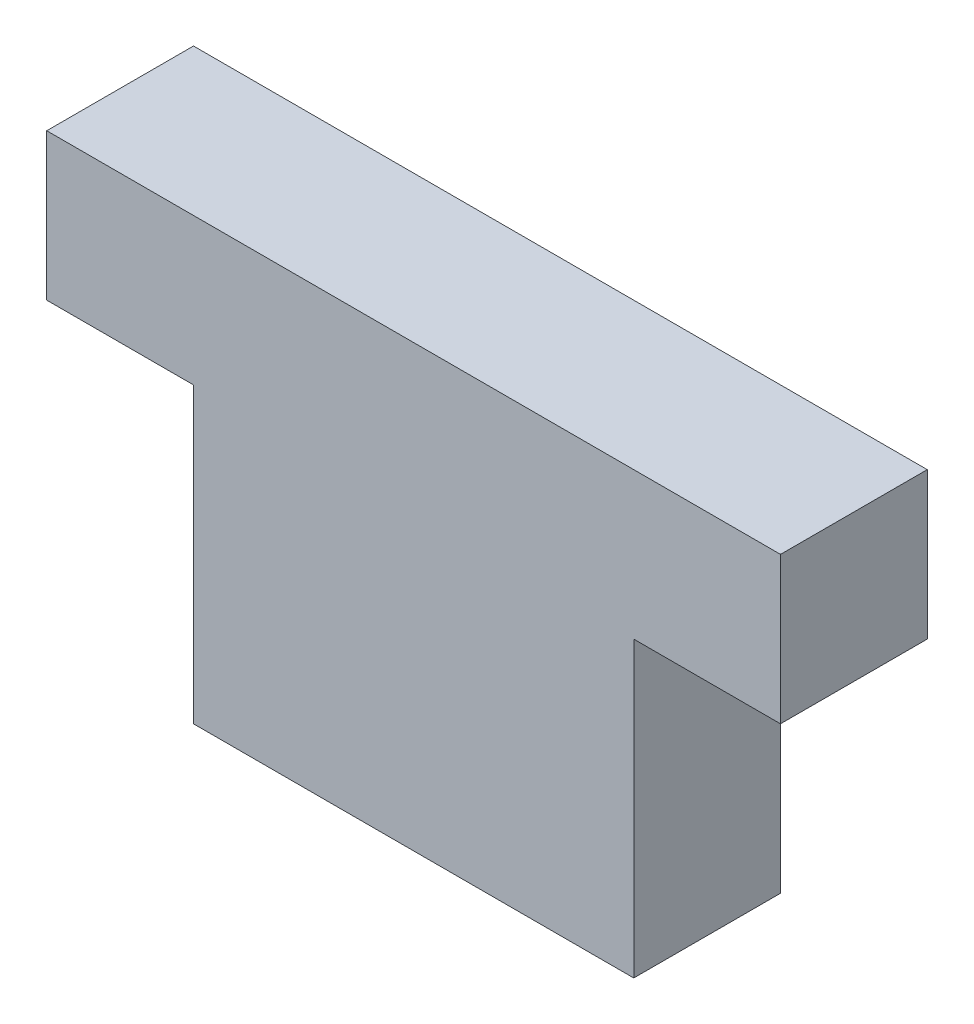
ISO-10303-21;
HEADER;
FILE_DESCRIPTION(('STEP AP214'),'2;1');
FILE_NAME('part.step','',(''),(''),'','','');
FILE_SCHEMA(('AUTOMOTIVE_DESIGN { 1 0 10303 214 1 1 1 1 }'));
ENDSEC;
DATA;
#1=APPLICATION_CONTEXT('core data for automotive mechanical design processes');
#2=APPLICATION_PROTOCOL_DEFINITION('international standard','automotive_design',2000,#1);
#3=PRODUCT_CONTEXT('',#1,'mechanical');
#4=PRODUCT('Part','Part','',(#3));
#5=PRODUCT_RELATED_PRODUCT_CATEGORY('part','',(#4));
#6=PRODUCT_DEFINITION_FORMATION('','',#4);
#7=PRODUCT_DEFINITION_CONTEXT('part definition',#1,'design');
#8=PRODUCT_DEFINITION('design','',#6,#7);
#9=PRODUCT_DEFINITION_SHAPE('','',#8);
#10=(LENGTH_UNIT() NAMED_UNIT(*) SI_UNIT(.MILLI.,.METRE.));
#11=(NAMED_UNIT(*) PLANE_ANGLE_UNIT() SI_UNIT($,.RADIAN.));
#12=(NAMED_UNIT(*) SI_UNIT($,.STERADIAN.) SOLID_ANGLE_UNIT());
#13=UNCERTAINTY_MEASURE_WITH_UNIT(LENGTH_MEASURE(1.E-05),#10,'distance_accuracy_value','');
#14=(GEOMETRIC_REPRESENTATION_CONTEXT(3) GLOBAL_UNCERTAINTY_ASSIGNED_CONTEXT((#13)) GLOBAL_UNIT_ASSIGNED_CONTEXT((#10,
#11,#12)) REPRESENTATION_CONTEXT('',''));
#15=CARTESIAN_POINT('',(0.,0.,0.));
#16=DIRECTION('',(0.,0.,1.));
#17=DIRECTION('',(1.,0.,0.));
#18=AXIS2_PLACEMENT_3D('',#15,#16,#17);
#19=CARTESIAN_POINT('',(-20.,10.,5.));
#20=DIRECTION('',(0.,1.,0.));
#21=DIRECTION('',(0.,0.,1.));
#22=AXIS2_PLACEMENT_3D('',#19,#20,#21);
#23=PLANE('',#22);
#24=DIRECTION('',(1.,0.,0.));
#25=VECTOR('',#24,1.);
#26=CARTESIAN_POINT('',(-20.,10.,0.));
#27=LINE('',#26,#25);
#28=CARTESIAN_POINT('',(-20.,10.,0.));
#29=VERTEX_POINT('',#28);
#30=CARTESIAN_POINT('',(-15.,10.,0.));
#31=VERTEX_POINT('',#30);
#32=EDGE_CURVE('E131',#29,#31,#27,.T.);
#33=ORIENTED_EDGE('',*,*,#32,.T.);
#34=DIRECTION('',(0.,0.,-1.));
#35=VECTOR('',#34,1.);
#36=CARTESIAN_POINT('',(-15.,10.,5.));
#37=LINE('',#36,#35);
#38=CARTESIAN_POINT('',(-15.,10.,5.));
#39=VERTEX_POINT('',#38);
#40=EDGE_CURVE('E11',#39,#31,#37,.T.);
#41=ORIENTED_EDGE('',*,*,#40,.F.);
#42=DIRECTION('',(1.,0.,0.));
#43=VECTOR('',#42,1.);
#44=CARTESIAN_POINT('',(-20.,10.,5.));
#45=LINE('',#44,#43);
#46=CARTESIAN_POINT('',(-20.,10.,5.));
#47=VERTEX_POINT('',#46);
#48=EDGE_CURVE('E145',#47,#39,#45,.T.);
#49=ORIENTED_EDGE('',*,*,#48,.F.);
#50=DIRECTION('',(0.,0.,-1.));
#51=VECTOR('',#50,1.);
#52=CARTESIAN_POINT('',(-20.,10.,5.));
#53=LINE('',#52,#51);
#54=EDGE_CURVE('E127',#47,#29,#53,.T.);
#55=ORIENTED_EDGE('',*,*,#54,.T.);
#56=EDGE_LOOP('',(#33,#41,#49,#55));
#57=FACE_BOUND('',#56,.T.);
#58=ADVANCED_FACE('F35',(#57),#23,.F.);
#59=CARTESIAN_POINT('',(-15.,10.,5.));
#60=DIRECTION('',(1.,0.,0.));
#61=DIRECTION('',(0.,1.,0.));
#62=AXIS2_PLACEMENT_3D('',#59,#60,#61);
#63=PLANE('',#62);
#64=DIRECTION('',(0.,-1.,0.));
#65=VECTOR('',#64,1.);
#66=CARTESIAN_POINT('',(-15.,10.,0.));
#67=LINE('',#66,#65);
#68=CARTESIAN_POINT('',(-15.,0.,0.));
#69=VERTEX_POINT('',#68);
#70=EDGE_CURVE('E134',#31,#69,#67,.T.);
#71=ORIENTED_EDGE('',*,*,#70,.T.);
#72=DIRECTION('',(0.,0.,-1.));
#73=VECTOR('',#72,1.);
#74=CARTESIAN_POINT('',(-15.,0.,5.));
#75=LINE('',#74,#73);
#76=CARTESIAN_POINT('',(-15.,0.,5.));
#77=VERTEX_POINT('',#76);
#78=EDGE_CURVE('E43',#77,#69,#75,.T.);
#79=ORIENTED_EDGE('',*,*,#78,.F.);
#80=DIRECTION('',(0.,-1.,0.));
#81=VECTOR('',#80,1.);
#82=CARTESIAN_POINT('',(-15.,10.,5.));
#83=LINE('',#82,#81);
#84=EDGE_CURVE('E94',#39,#77,#83,.T.);
#85=ORIENTED_EDGE('',*,*,#84,.F.);
#86=ORIENTED_EDGE('',*,*,#40,.T.);
#87=EDGE_LOOP('',(#71,#79,#85,#86));
#88=FACE_BOUND('',#87,.T.);
#89=ADVANCED_FACE('F180',(#88),#63,.F.);
#90=CARTESIAN_POINT('',(-15.,0.,5.));
#91=DIRECTION('',(0.,1.,0.));
#92=DIRECTION('',(0.,0.,1.));
#93=AXIS2_PLACEMENT_3D('',#90,#91,#92);
#94=PLANE('',#93);
#95=DIRECTION('',(1.,0.,0.));
#96=VECTOR('',#95,1.);
#97=CARTESIAN_POINT('',(-15.,0.,0.));
#98=LINE('',#97,#96);
#99=CARTESIAN_POINT('',(0.,0.,0.));
#100=VERTEX_POINT('',#99);
#101=EDGE_CURVE('E136',#69,#100,#98,.T.);
#102=ORIENTED_EDGE('',*,*,#101,.T.);
#103=DIRECTION('',(0.,0.,-1.));
#104=VECTOR('',#103,1.);
#105=CARTESIAN_POINT('',(0.,0.,5.));
#106=LINE('',#105,#104);
#107=CARTESIAN_POINT('',(0.,0.,5.));
#108=VERTEX_POINT('',#107);
#109=EDGE_CURVE('E152',#108,#100,#106,.T.);
#110=ORIENTED_EDGE('',*,*,#109,.F.);
#111=DIRECTION('',(1.,0.,0.));
#112=VECTOR('',#111,1.);
#113=CARTESIAN_POINT('',(-15.,0.,5.));
#114=LINE('',#113,#112);
#115=EDGE_CURVE('E160',#77,#108,#114,.T.);
#116=ORIENTED_EDGE('',*,*,#115,.F.);
#117=ORIENTED_EDGE('',*,*,#78,.T.);
#118=EDGE_LOOP('',(#102,#110,#116,#117));
#119=FACE_BOUND('',#118,.T.);
#120=ADVANCED_FACE('F158',(#119),#94,.F.);
#121=CARTESIAN_POINT('',(0.,10.,5.));
#122=DIRECTION('',(-1.,0.,0.));
#123=DIRECTION('',(0.,-1.,0.));
#124=AXIS2_PLACEMENT_3D('',#121,#122,#123);
#125=PLANE('',#124);
#126=DIRECTION('',(0.,1.,0.));
#127=VECTOR('',#126,1.);
#128=CARTESIAN_POINT('',(0.,10.,0.));
#129=LINE('',#128,#127);
#130=CARTESIAN_POINT('',(0.,10.,0.));
#131=VERTEX_POINT('',#130);
#132=EDGE_CURVE('E138',#100,#131,#129,.T.);
#133=ORIENTED_EDGE('',*,*,#132,.T.);
#134=DIRECTION('',(0.,0.,-1.));
#135=VECTOR('',#134,1.);
#136=CARTESIAN_POINT('',(0.,10.,5.));
#137=LINE('',#136,#135);
#138=CARTESIAN_POINT('',(0.,10.,5.));
#139=VERTEX_POINT('',#138);
#140=EDGE_CURVE('E149',#139,#131,#137,.T.);
#141=ORIENTED_EDGE('',*,*,#140,.F.);
#142=DIRECTION('',(0.,1.,0.));
#143=VECTOR('',#142,1.);
#144=CARTESIAN_POINT('',(0.,10.,5.));
#145=LINE('',#144,#143);
#146=EDGE_CURVE('E172',#108,#139,#145,.T.);
#147=ORIENTED_EDGE('',*,*,#146,.F.);
#148=ORIENTED_EDGE('',*,*,#109,.T.);
#149=EDGE_LOOP('',(#133,#141,#147,#148));
#150=FACE_BOUND('',#149,.T.);
#151=ADVANCED_FACE('F168',(#150),#125,.F.);
#152=CARTESIAN_POINT('',(0.,10.,5.));
#153=DIRECTION('',(0.,1.,0.));
#154=DIRECTION('',(0.,0.,1.));
#155=AXIS2_PLACEMENT_3D('',#152,#153,#154);
#156=PLANE('',#155);
#157=DIRECTION('',(1.,0.,0.));
#158=VECTOR('',#157,1.);
#159=CARTESIAN_POINT('',(0.,10.,0.));
#160=LINE('',#159,#158);
#161=CARTESIAN_POINT('',(5.,10.,0.));
#162=VERTEX_POINT('',#161);
#163=EDGE_CURVE('E140',#131,#162,#160,.T.);
#164=ORIENTED_EDGE('',*,*,#163,.T.);
#165=DIRECTION('',(0.,0.,-1.));
#166=VECTOR('',#165,1.);
#167=CARTESIAN_POINT('',(5.,10.,5.));
#168=LINE('',#167,#166);
#169=CARTESIAN_POINT('',(5.,10.,5.));
#170=VERTEX_POINT('',#169);
#171=EDGE_CURVE('E122',#170,#162,#168,.T.);
#172=ORIENTED_EDGE('',*,*,#171,.F.);
#173=DIRECTION('',(1.,0.,0.));
#174=VECTOR('',#173,1.);
#175=CARTESIAN_POINT('',(0.,10.,5.));
#176=LINE('',#175,#174);
#177=EDGE_CURVE('E113',#139,#170,#176,.T.);
#178=ORIENTED_EDGE('',*,*,#177,.F.);
#179=ORIENTED_EDGE('',*,*,#140,.T.);
#180=EDGE_LOOP('',(#164,#172,#178,#179));
#181=FACE_BOUND('',#180,.T.);
#182=ADVANCED_FACE('F171',(#181),#156,.F.);
#183=CARTESIAN_POINT('',(5.,10.,5.));
#184=DIRECTION('',(-1.,0.,0.));
#185=DIRECTION('',(0.,0.,1.));
#186=AXIS2_PLACEMENT_3D('',#183,#184,#185);
#187=PLANE('',#186);
#188=DIRECTION('',(0.,1.,0.));
#189=VECTOR('',#188,1.);
#190=CARTESIAN_POINT('',(5.,10.,0.));
#191=LINE('',#190,#189);
#192=CARTESIAN_POINT('',(5.,15.,0.));
#193=VERTEX_POINT('',#192);
#194=EDGE_CURVE('E121',#162,#193,#191,.T.);
#195=ORIENTED_EDGE('',*,*,#194,.T.);
#196=DIRECTION('',(0.,0.,-1.));
#197=VECTOR('',#196,1.);
#198=CARTESIAN_POINT('',(5.,15.,5.));
#199=LINE('',#198,#197);
#200=CARTESIAN_POINT('',(5.,15.,5.));
#201=VERTEX_POINT('',#200);
#202=EDGE_CURVE('E118',#201,#193,#199,.T.);
#203=ORIENTED_EDGE('',*,*,#202,.F.);
#204=DIRECTION('',(0.,1.,0.));
#205=VECTOR('',#204,1.);
#206=CARTESIAN_POINT('',(5.,10.,5.));
#207=LINE('',#206,#205);
#208=EDGE_CURVE('E107',#170,#201,#207,.T.);
#209=ORIENTED_EDGE('',*,*,#208,.F.);
#210=ORIENTED_EDGE('',*,*,#171,.T.);
#211=EDGE_LOOP('',(#195,#203,#209,#210));
#212=FACE_BOUND('',#211,.T.);
#213=ADVANCED_FACE('F119',(#212),#187,.F.);
#214=CARTESIAN_POINT('',(-20.,15.,5.));
#215=DIRECTION('',(0.,-1.,0.));
#216=DIRECTION('',(0.,0.,-1.));
#217=AXIS2_PLACEMENT_3D('',#214,#215,#216);
#218=PLANE('',#217);
#219=DIRECTION('',(-1.,0.,0.));
#220=VECTOR('',#219,1.);
#221=CARTESIAN_POINT('',(-20.,15.,0.));
#222=LINE('',#221,#220);
#223=CARTESIAN_POINT('',(-20.,15.,0.));
#224=VERTEX_POINT('',#223);
#225=EDGE_CURVE('E80',#193,#224,#222,.T.);
#226=ORIENTED_EDGE('',*,*,#225,.T.);
#227=DIRECTION('',(0.,0.,-1.));
#228=VECTOR('',#227,1.);
#229=CARTESIAN_POINT('',(-20.,15.,5.));
#230=LINE('',#229,#228);
#231=CARTESIAN_POINT('',(-20.,15.,5.));
#232=VERTEX_POINT('',#231);
#233=EDGE_CURVE('E123',#232,#224,#230,.T.);
#234=ORIENTED_EDGE('',*,*,#233,.F.);
#235=DIRECTION('',(-1.,0.,0.));
#236=VECTOR('',#235,1.);
#237=CARTESIAN_POINT('',(-20.,15.,5.));
#238=LINE('',#237,#236);
#239=EDGE_CURVE('E111',#201,#232,#238,.T.);
#240=ORIENTED_EDGE('',*,*,#239,.F.);
#241=ORIENTED_EDGE('',*,*,#202,.T.);
#242=EDGE_LOOP('',(#226,#234,#240,#241));
#243=FACE_BOUND('',#242,.T.);
#244=ADVANCED_FACE('F125',(#243),#218,.F.);
#245=CARTESIAN_POINT('',(-20.,10.,5.));
#246=DIRECTION('',(1.,0.,0.));
#247=DIRECTION('',(0.,0.,-1.));
#248=AXIS2_PLACEMENT_3D('',#245,#246,#247);
#249=PLANE('',#248);
#250=DIRECTION('',(0.,-1.,0.));
#251=VECTOR('',#250,1.);
#252=CARTESIAN_POINT('',(-20.,10.,0.));
#253=LINE('',#252,#251);
#254=EDGE_CURVE('E86',#224,#29,#253,.T.);
#255=ORIENTED_EDGE('',*,*,#254,.T.);
#256=ORIENTED_EDGE('',*,*,#54,.F.);
#257=DIRECTION('',(0.,-1.,0.));
#258=VECTOR('',#257,1.);
#259=CARTESIAN_POINT('',(-20.,10.,5.));
#260=LINE('',#259,#258);
#261=EDGE_CURVE('E51',#232,#47,#260,.T.);
#262=ORIENTED_EDGE('',*,*,#261,.F.);
#263=ORIENTED_EDGE('',*,*,#233,.T.);
#264=EDGE_LOOP('',(#255,#256,#262,#263));
#265=FACE_BOUND('',#264,.T.);
#266=ADVANCED_FACE('F196',(#265),#249,.F.);
#267=CARTESIAN_POINT('',(0.,0.,5.));
#268=DIRECTION('',(0.,0.,-1.));
#269=DIRECTION('',(-1.,0.,0.));
#270=AXIS2_PLACEMENT_3D('',#267,#268,#269);
#271=PLANE('',#270);
#272=ORIENTED_EDGE('',*,*,#48,.T.);
#273=ORIENTED_EDGE('',*,*,#84,.T.);
#274=ORIENTED_EDGE('',*,*,#115,.T.);
#275=ORIENTED_EDGE('',*,*,#146,.T.);
#276=ORIENTED_EDGE('',*,*,#177,.T.);
#277=ORIENTED_EDGE('',*,*,#208,.T.);
#278=ORIENTED_EDGE('',*,*,#239,.T.);
#279=ORIENTED_EDGE('',*,*,#261,.T.);
#280=EDGE_LOOP('',(#272,#273,#274,#275,#276,#277,#278,#279));
#281=FACE_BOUND('',#280,.T.);
#282=ADVANCED_FACE('F109',(#281),#271,.F.);
#283=CARTESIAN_POINT('',(0.,0.,0.));
#284=DIRECTION('',(0.,0.,-1.));
#285=DIRECTION('',(-1.,0.,0.));
#286=AXIS2_PLACEMENT_3D('',#283,#284,#285);
#287=PLANE('',#286);
#288=ORIENTED_EDGE('',*,*,#32,.F.);
#289=ORIENTED_EDGE('',*,*,#254,.F.);
#290=ORIENTED_EDGE('',*,*,#225,.F.);
#291=ORIENTED_EDGE('',*,*,#194,.F.);
#292=ORIENTED_EDGE('',*,*,#163,.F.);
#293=ORIENTED_EDGE('',*,*,#132,.F.);
#294=ORIENTED_EDGE('',*,*,#101,.F.);
#295=ORIENTED_EDGE('',*,*,#70,.F.);
#296=EDGE_LOOP('',(#288,#289,#290,#291,#292,#293,#294,#295));
#297=FACE_BOUND('',#296,.T.);
#298=ADVANCED_FACE('F164',(#297),#287,.T.);
#299=CLOSED_SHELL('',(#58,#89,#120,#151,#182,#213,#244,#266,#282,#298));
#300=MANIFOLD_SOLID_BREP('B2',#299);
#301=ADVANCED_BREP_SHAPE_REPRESENTATION('',(#18,#300),#14);
#302=SHAPE_DEFINITION_REPRESENTATION(#9,#301);
ENDSEC;
END-ISO-10303-21;
